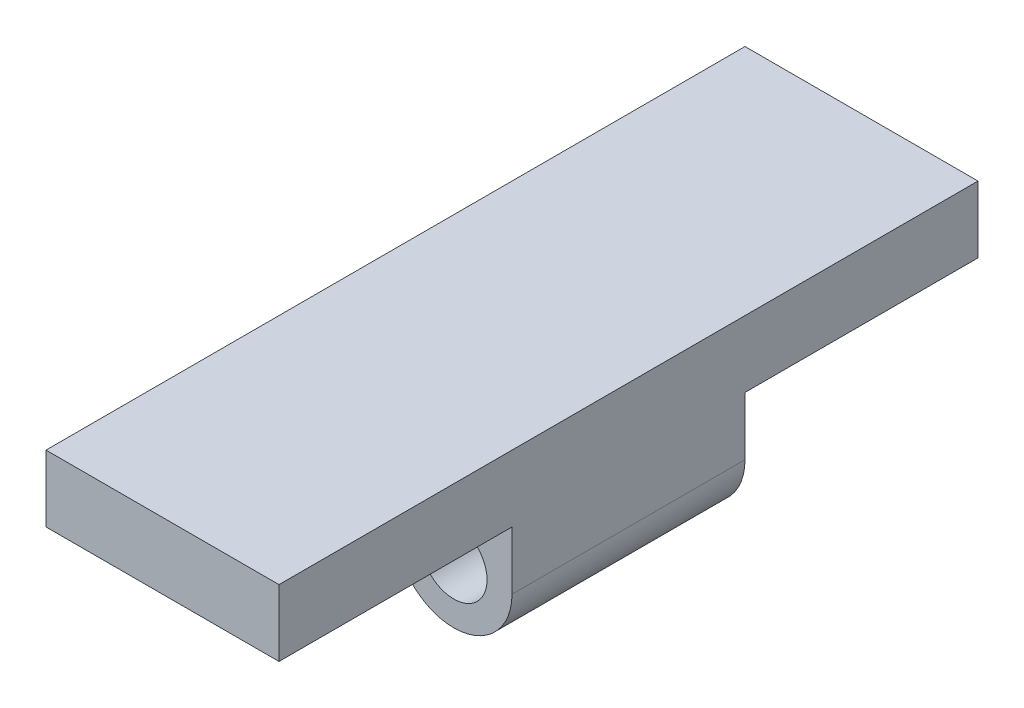
ISO-10303-21;
HEADER;
FILE_DESCRIPTION(('STEP AP214'),'2;1');
FILE_NAME('part.step','',(''),(''),'','','');
FILE_SCHEMA(('AUTOMOTIVE_DESIGN { 1 0 10303 214 1 1 1 1 }'));
ENDSEC;
DATA;
#1=APPLICATION_CONTEXT('core data for automotive mechanical design processes');
#2=APPLICATION_PROTOCOL_DEFINITION('international standard','automotive_design',2000,#1);
#3=PRODUCT_CONTEXT('',#1,'mechanical');
#4=PRODUCT('Part','Part','',(#3));
#5=PRODUCT_RELATED_PRODUCT_CATEGORY('part','',(#4));
#6=PRODUCT_DEFINITION_FORMATION('','',#4);
#7=PRODUCT_DEFINITION_CONTEXT('part definition',#1,'design');
#8=PRODUCT_DEFINITION('design','',#6,#7);
#9=PRODUCT_DEFINITION_SHAPE('','',#8);
#10=(LENGTH_UNIT() NAMED_UNIT(*) SI_UNIT(.MILLI.,.METRE.));
#11=(NAMED_UNIT(*) PLANE_ANGLE_UNIT() SI_UNIT($,.RADIAN.));
#12=(NAMED_UNIT(*) SI_UNIT($,.STERADIAN.) SOLID_ANGLE_UNIT());
#13=UNCERTAINTY_MEASURE_WITH_UNIT(LENGTH_MEASURE(1.E-05),#10,'distance_accuracy_value','');
#14=(GEOMETRIC_REPRESENTATION_CONTEXT(3) GLOBAL_UNCERTAINTY_ASSIGNED_CONTEXT((#13)) GLOBAL_UNIT_ASSIGNED_CONTEXT((#10,
#11,#12)) REPRESENTATION_CONTEXT('',''));
#15=CARTESIAN_POINT('',(0.,0.,0.));
#16=DIRECTION('',(0.,0.,1.));
#17=DIRECTION('',(1.,0.,0.));
#18=AXIS2_PLACEMENT_3D('',#15,#16,#17);
#19=CARTESIAN_POINT('',(-5.54065999602521,-1.7493965465254,4.5));
#20=DIRECTION('',(0.,0.,-1.));
#21=DIRECTION('',(-1.,0.,0.));
#22=AXIS2_PLACEMENT_3D('',#19,#20,#21);
#23=CYLINDRICAL_SURFACE('',#22,0.975);
#24=CARTESIAN_POINT('',(-5.54065999602521,-1.7493965465254,4.5));
#25=DIRECTION('',(0.,0.,1.));
#26=DIRECTION('',(1.,0.,0.));
#27=AXIS2_PLACEMENT_3D('',#24,#25,#26);
#28=CIRCLE('',#27,0.975);
#29=CARTESIAN_POINT('',(-4.56565999602521,-1.7493965465254,4.5));
#30=VERTEX_POINT('',#29);
#31=EDGE_CURVE('E11',#30,#30,#28,.T.);
#32=ORIENTED_EDGE('',*,*,#31,.F.);
#33=EDGE_LOOP('',(#32));
#34=FACE_BOUND('',#33,.T.);
#35=CARTESIAN_POINT('',(-5.54065999602521,-1.7493965465254,-4.5));
#36=DIRECTION('',(0.,0.,1.));
#37=DIRECTION('',(1.,0.,0.));
#38=AXIS2_PLACEMENT_3D('',#35,#36,#37);
#39=CIRCLE('',#38,0.975);
#40=CARTESIAN_POINT('',(-4.56565999602521,-1.7493965465254,-4.5));
#41=VERTEX_POINT('',#40);
#42=EDGE_CURVE('E58',#41,#41,#39,.T.);
#43=ORIENTED_EDGE('',*,*,#42,.T.);
#44=EDGE_LOOP('',(#43));
#45=FACE_BOUND('',#44,.T.);
#46=ADVANCED_FACE('F55',(#34,#45),#23,.T.);
#47=CARTESIAN_POINT('',(-5.54065999602521,-1.7493965465254,4.5));
#48=DIRECTION('',(0.,0.,1.));
#49=DIRECTION('',(1.,0.,0.));
#50=AXIS2_PLACEMENT_3D('',#47,#48,#49);
#51=PLANE('',#50);
#52=ORIENTED_EDGE('',*,*,#31,.T.);
#53=EDGE_LOOP('',(#52));
#54=FACE_BOUND('',#53,.T.);
#55=ADVANCED_FACE('F70',(#54),#51,.T.);
#56=CARTESIAN_POINT('',(-5.54065999602521,-1.7493965465254,-4.5));
#57=DIRECTION('',(0.,0.,1.));
#58=DIRECTION('',(1.,0.,0.));
#59=AXIS2_PLACEMENT_3D('',#56,#57,#58);
#60=PLANE('',#59);
#61=ORIENTED_EDGE('',*,*,#42,.F.);
#62=EDGE_LOOP('',(#61));
#63=FACE_BOUND('',#62,.T.);
#64=ADVANCED_FACE('F68',(#63),#60,.F.);
#65=CLOSED_SHELL('',(#46,#55,#64));
#66=MANIFOLD_SOLID_BREP('B2_NOT_SHOWN',#65);
#67=CARTESIAN_POINT('',(-3.59065999602521,2.0006034534746,10.5));
#68=DIRECTION('',(1.,0.,0.));
#69=DIRECTION('',(0.,1.,0.));
#70=AXIS2_PLACEMENT_3D('',#67,#68,#69);
#71=PLANE('',#70);
#72=DIRECTION('',(0.,-1.,0.));
#73=VECTOR('',#72,1.);
#74=CARTESIAN_POINT('',(-3.59065999602521,2.0006034534746,-10.5));
#75=LINE('',#74,#73);
#76=CARTESIAN_POINT('',(-3.59065999602521,2.0006034534746,-10.5));
#77=VERTEX_POINT('',#76);
#78=CARTESIAN_POINT('',(-3.59065999602521,0.000603453474596477,-10.5));
#79=VERTEX_POINT('',#78);
#80=EDGE_CURVE('E243',#77,#79,#75,.T.);
#81=ORIENTED_EDGE('',*,*,#80,.T.);
#82=DIRECTION('',(0.,0.,-1.));
#83=VECTOR('',#82,1.);
#84=CARTESIAN_POINT('',(-3.59065999602521,0.000603453474596477,10.5));
#85=LINE('',#84,#83);
#86=CARTESIAN_POINT('',(-3.59065999602521,0.000603453474596477,10.5));
#87=VERTEX_POINT('',#86);
#88=EDGE_CURVE('E277',#87,#79,#85,.T.);
#89=ORIENTED_EDGE('',*,*,#88,.F.);
#90=DIRECTION('',(0.,-1.,0.));
#91=VECTOR('',#90,1.);
#92=CARTESIAN_POINT('',(-3.59065999602521,2.0006034534746,10.5));
#93=LINE('',#92,#91);
#94=CARTESIAN_POINT('',(-3.59065999602521,2.0006034534746,10.5));
#95=VERTEX_POINT('',#94);
#96=EDGE_CURVE('E244',#95,#87,#93,.T.);
#97=ORIENTED_EDGE('',*,*,#96,.F.);
#98=DIRECTION('',(0.,0.,-1.));
#99=VECTOR('',#98,1.);
#100=CARTESIAN_POINT('',(-3.59065999602521,2.0006034534746,10.5));
#101=LINE('',#100,#99);
#102=EDGE_CURVE('E258',#95,#77,#101,.T.);
#103=ORIENTED_EDGE('',*,*,#102,.T.);
#104=EDGE_LOOP('',(#81,#89,#97,#103));
#105=FACE_BOUND('',#104,.T.);
#106=ADVANCED_FACE('F96',(#105),#71,.F.);
#107=CARTESIAN_POINT('',(-3.59065999602521,0.000603453474596477,10.5));
#108=DIRECTION('',(0.,1.,0.));
#109=DIRECTION('',(-1.,0.,0.));
#110=AXIS2_PLACEMENT_3D('',#107,#108,#109);
#111=PLANE('',#110);
#112=CARTESIAN_POINT('',(0.681720388759362,0.000603453474596471,-9.26955491219158));
#113=CARTESIAN_POINT('',(0.663542159192776,0.000603453474596471,-9.31656854773316));
#114=CARTESIAN_POINT('',(0.641406634725155,0.000603453474596471,-9.36213099101214));
#115=CARTESIAN_POINT('',(0.589751617970108,0.000603453474596471,-9.44896257911029));
#116=CARTESIAN_POINT('',(0.560214895027673,0.000603453474596471,-9.49022138270405));
#117=CARTESIAN_POINT('',(0.494626689584325,0.000603453474596471,-9.56714020949138));
#118=CARTESIAN_POINT('',(0.458580642596942,0.000603453474596471,-9.60280485791836));
#119=CARTESIAN_POINT('',(0.381035142719658,0.000603453474596471,-9.66755371808758));
#120=CARTESIAN_POINT('',(0.339538449105283,0.000603453474596471,-9.69664123922111));
#121=CARTESIAN_POINT('',(0.252252273186043,0.000603453474596471,-9.74754847292033));
#122=CARTESIAN_POINT('',(0.206458364747904,0.000603453474596471,-9.7693605841522));
#123=CARTESIAN_POINT('',(0.111934849875646,0.000603453474596471,-9.80522180176773));
#124=CARTESIAN_POINT('',(0.0632050621028175,0.000603453474596472,-9.81927042808255));
#125=CARTESIAN_POINT('',(-0.0373013947134258,0.000603453474596472,-9.83974704620741));
#126=CARTESIAN_POINT('',(-0.0891254702804252,0.000603453474596472,-9.84594109252989));
#127=CARTESIAN_POINT('',(-0.19310329433834,0.000603453474596472,-9.85011311445659));
#128=CARTESIAN_POINT('',(-0.245257180784777,0.000603453474596472,-9.84808738875449));
#129=CARTESIAN_POINT('',(-0.352172546323013,0.000603453474596472,-9.83588410514095));
#130=CARTESIAN_POINT('',(-0.406870867850129,0.000603453474596472,-9.82516279590368));
#131=CARTESIAN_POINT('',(-0.514030056087182,0.000603453474596472,-9.795788666266));
#132=CARTESIAN_POINT('',(-0.566491970102047,0.000603453474596472,-9.77713960432516));
#133=CARTESIAN_POINT('',(-0.656820825706323,0.000603453474596473,-9.73811264631092));
#134=CARTESIAN_POINT('',(-0.695290307925883,0.000603453474596473,-9.7190961077003));
#135=CARTESIAN_POINT('',(-0.770349262452686,0.000603453474596473,-9.67763343157583));
#136=CARTESIAN_POINT('',(-0.806937752158766,0.000603453474596473,-9.65518552541424));
#137=CARTESIAN_POINT('',(-0.878328341116614,0.000603453474596473,-9.60746502950204));
#138=CARTESIAN_POINT('',(-0.913125914327633,0.000603453474596473,-9.58218575111585));
#139=CARTESIAN_POINT('',(-0.981104258332806,0.000603453474596473,-9.52952478472204));
#140=CARTESIAN_POINT('',(-1.01428420415691,0.000603453474596473,-9.502142041934));
#141=CARTESIAN_POINT('',(-1.11752817456632,0.000603453474596473,-9.41315902780537));
#142=CARTESIAN_POINT('',(-1.18533222893316,0.000603453474596473,-9.34900431961328));
#143=CARTESIAN_POINT('',(-1.28789196642034,0.000603453474596474,-9.2535506716074));
#144=CARTESIAN_POINT('',(-1.3222722877457,0.000603453474596474,-9.22181618404493));
#145=CARTESIAN_POINT('',(-1.39200533909982,0.000603453474596474,-9.1595233867459));
#146=CARTESIAN_POINT('',(-1.42735646854325,0.000603453474596474,-9.12896331944109));
#147=CARTESIAN_POINT('',(-1.49979444003922,0.000603453474596474,-9.06898833931851));
#148=CARTESIAN_POINT('',(-1.53689787534192,0.000603453474596474,-9.03959348606564));
#149=CARTESIAN_POINT('',(-1.6120847474395,0.000603453474596474,-8.98207430890645));
#150=CARTESIAN_POINT('',(-1.65016850874754,0.000603453474596474,-8.95395041443503));
#151=CARTESIAN_POINT('',(-1.72676130761758,0.000603453474596474,-8.89796911260626));
#152=CARTESIAN_POINT('',(-1.76527144072327,0.000603453474596474,-8.87011323676237));
#153=CARTESIAN_POINT('',(-1.84174673025448,0.000603453474596475,-8.8136615004782));
#154=CARTESIAN_POINT('',(-1.87971197896252,0.000603453474596475,-8.78506576769646));
#155=CARTESIAN_POINT('',(-1.95365483678642,0.000603453474596475,-8.72660708858899));
#156=CARTESIAN_POINT('',(-1.98965502143664,0.000603453474596475,-8.69677318764794));
#157=CARTESIAN_POINT('',(-2.0595144338115,0.000603453474596475,-8.63470407397276));
#158=CARTESIAN_POINT('',(-2.09337495417057,0.000603453474596475,-8.60247033719395));
#159=CARTESIAN_POINT('',(-2.15797824031286,0.000603453474596475,-8.53534430066004));
#160=CARTESIAN_POINT('',(-2.18873771818079,0.000603453474596475,-8.50046824743378));
#161=CARTESIAN_POINT('',(-2.24652589572852,0.000603453474596475,-8.42777265241198));
#162=CARTESIAN_POINT('',(-2.27355839004416,0.000603453474596475,-8.38995616672181));
#163=CARTESIAN_POINT('',(-2.3139800477159,0.000603453474596475,-8.32597009114296));
#164=CARTESIAN_POINT('',(-2.32872305357184,0.000603453474596475,-8.3006513474368));
#165=CARTESIAN_POINT('',(-2.35624753829769,0.000603453474596475,-8.24894944486435));
#166=CARTESIAN_POINT('',(-2.36902761640685,0.000603453474596475,-8.22256554269204));
#167=CARTESIAN_POINT('',(-2.40427036375027,0.000603453474596475,-8.14168060912752));
#168=CARTESIAN_POINT('',(-2.42347215026709,0.000603453474596475,-8.08570071194039));
#169=CARTESIAN_POINT('',(-2.45195958171875,0.000603453474596475,-7.97107710771409));
#170=CARTESIAN_POINT('',(-2.46121439833696,0.000603453474596475,-7.91242570305744));
#171=CARTESIAN_POINT('',(-2.46885823413609,0.000603453474596475,-7.79449685830923));
#172=CARTESIAN_POINT('',(-2.4672691632409,0.000603453474596475,-7.73522092203291));
#173=CARTESIAN_POINT('',(-2.4534546682422,0.000603453474596475,-7.62231304790584));
#174=CARTESIAN_POINT('',(-2.44201354308564,0.000603453474596475,-7.568584807272));
#175=CARTESIAN_POINT('',(-2.40968446028118,0.000603453474596475,-7.4640256778887));
#176=CARTESIAN_POINT('',(-2.38879602044468,0.000603453474596475,-7.41319493717603));
#177=CARTESIAN_POINT('',(-2.33967109146057,0.000603453474596475,-7.31910060649296));
#178=CARTESIAN_POINT('',(-2.31195286541316,0.000603453474596475,-7.27556565589951));
#179=CARTESIAN_POINT('',(-2.24946301118781,0.000603453474596475,-7.19390053666834));
#180=CARTESIAN_POINT('',(-2.21469296363216,0.000603453474596475,-7.15576916010067));
#181=CARTESIAN_POINT('',(-2.13989115737953,0.000603453474596475,-7.08671410152857));
#182=CARTESIAN_POINT('',(-2.09997684813183,0.000603453474596475,-7.05566296853579));
#183=CARTESIAN_POINT('',(-2.01555117574501,0.000603453474596475,-7.00063802606994));
#184=CARTESIAN_POINT('',(-1.9710405340138,0.000603453474596475,-6.97666310823621));
#185=CARTESIAN_POINT('',(-1.8782496408283,0.000603453474596475,-6.93612396941247));
#186=CARTESIAN_POINT('',(-1.82993664463121,0.000603453474596475,-6.91963488635712));
#187=CARTESIAN_POINT('',(-1.73127226721783,0.000603453474596474,-6.89465524882504));
#188=CARTESIAN_POINT('',(-1.68091980789846,0.000603453474596474,-6.88616898391144));
#189=CARTESIAN_POINT('',(-1.57743237273474,0.000603453474596474,-6.87695744397063));
#190=CARTESIAN_POINT('',(-1.52426824664383,0.000603453474596474,-6.87656644518718));
#191=CARTESIAN_POINT('',(-1.41855946662129,0.000603453474596474,-6.88399868133448));
#192=CARTESIAN_POINT('',(-1.36601445866364,0.000603453474596474,-6.89181696595662));
#193=CARTESIAN_POINT('',(-1.28626403395644,0.000603453474596474,-6.90965253743286));
#194=CARTESIAN_POINT('',(-1.25843645151365,0.000603453474596474,-6.91703861411827));
#195=CARTESIAN_POINT('',(-1.20339214317216,0.000603453474596474,-6.93388225896658));
#196=CARTESIAN_POINT('',(-1.1761758162043,0.000603453474596473,-6.94334113896162));
#197=CARTESIAN_POINT('',(-1.12247254870455,0.000603453474596473,-6.96417391339395));
#198=CARTESIAN_POINT('',(-1.09598603945325,0.000603453474596473,-6.97554891305778));
#199=CARTESIAN_POINT('',(-1.04387898934529,0.000603453474596473,-7.00001010534023));
#200=CARTESIAN_POINT('',(-1.01825697640921,0.000603453474596473,-7.01309318288316));
#201=CARTESIAN_POINT('',(-0.944344463379301,0.000603453474596473,-7.0537448393978));
#202=CARTESIAN_POINT('',(-0.897213972725778,0.000603453474596473,-7.08343733594015));
#203=CARTESIAN_POINT('',(-0.805999352446716,0.000603453474596473,-7.14719698219771));
#204=CARTESIAN_POINT('',(-0.761919303381317,0.000603453474596473,-7.18126982387998));
#205=CARTESIAN_POINT('',(-0.675827108923218,0.000603453474596473,-7.25250484474097));
#206=CARTESIAN_POINT('',(-0.63383271976555,0.000603453474596473,-7.28968805711166));
#207=CARTESIAN_POINT('',(-0.551003365190106,0.000603453474596472,-7.36528682246381));
#208=CARTESIAN_POINT('',(-0.510168368521605,0.000603453474596472,-7.40370234216959));
#209=CARTESIAN_POINT('',(-0.427516445444948,0.000603453474596472,-7.4806235962903));
#210=CARTESIAN_POINT('',(-0.385693737324139,0.000603453474596472,-7.51912331196266));
#211=CARTESIAN_POINT('',(-0.300377716040168,0.000603453474596472,-7.5941968489123));
#212=CARTESIAN_POINT('',(-0.256885516936883,0.000603453474596472,-7.63077191716624));
#213=CARTESIAN_POINT('',(-0.168247595007555,0.000603453474596472,-7.70155725321176));
#214=CARTESIAN_POINT('',(-0.123107276337051,0.000603453474596472,-7.73577434460995));
#215=CARTESIAN_POINT('',(-0.0320044677015208,0.000603453474596472,-7.80312070557043));
#216=CARTESIAN_POINT('',(0.013958452786283,0.000603453474596472,-7.83624937814832));
#217=CARTESIAN_POINT('',(0.0904487343187735,0.000603453474596472,-7.89236441040536));
#218=CARTESIAN_POINT('',(0.121128199115598,0.000603453474596472,-7.91514021866265));
#219=CARTESIAN_POINT('',(0.181807662982751,0.000603453474596471,-7.96159943020429));
#220=CARTESIAN_POINT('',(0.211807559749918,0.000603453474596471,-7.9852829687139));
#221=CARTESIAN_POINT('',(0.270586273891709,0.000603453474596471,-8.03392857590256));
#222=CARTESIAN_POINT('',(0.299369020675024,0.000603453474596471,-8.05888584652753));
#223=CARTESIAN_POINT('',(0.355392575272122,0.000603453474596471,-8.11049462035996));
#224=CARTESIAN_POINT('',(0.382633220210745,0.000603453474596471,-8.13714630190051));
#225=CARTESIAN_POINT('',(0.435593985410183,0.000603453474596471,-8.19284460220643));
#226=CARTESIAN_POINT('',(0.461278490712908,0.000603453474596471,-8.22192535927447));
#227=CARTESIAN_POINT('',(0.510119398760506,0.000603453474596471,-8.28214861708743));
#228=CARTESIAN_POINT('',(0.533275866992297,0.000603453474596471,-8.31329106439223));
#229=CARTESIAN_POINT('',(0.576636575451473,0.000603453474596471,-8.37765751021521));
#230=CARTESIAN_POINT('',(0.596835833125466,0.000603453474596471,-8.41088489007489));
#231=CARTESIAN_POINT('',(0.63378996785883,0.000603453474596471,-8.47920211342516));
#232=CARTESIAN_POINT('',(0.650544914607798,0.000603453474596471,-8.51429191921475));
#233=CARTESIAN_POINT('',(0.686939201644475,0.000603453474596471,-8.60239129544451));
#234=CARTESIAN_POINT('',(0.704439891023661,0.000603453474596471,-8.65630985553794));
#235=CARTESIAN_POINT('',(0.730216650062091,0.000603453474596471,-8.76628129678649));
#236=CARTESIAN_POINT('',(0.738500317990543,0.000603453474596471,-8.82233238046));
#237=CARTESIAN_POINT('',(0.745186883892795,0.000603453474596471,-8.93533881516929));
#238=CARTESIAN_POINT('',(0.743536469753532,0.000603453474596471,-8.99229740619061));
#239=CARTESIAN_POINT('',(0.729909630583895,0.000603453474596471,-9.10488402657672));
#240=CARTESIAN_POINT('',(0.717960641390336,0.000603453474596471,-9.16051518794005));
#241=CARTESIAN_POINT('',(0.695167169097829,0.000603453474596471,-9.23303614006756));
#242=CARTESIAN_POINT('',(0.688738718310995,0.000603453474596471,-9.25140368429326));
#243=CARTESIAN_POINT('',(0.681720388759362,0.000603453474596471,-9.26955491219158));
#244=B_SPLINE_CURVE_WITH_KNOTS('',3,(#112,#113,#114,#115,#116,#117,#118,#119,#120,#121,#122,
#123,#124,#125,#126,#127,#128,#129,#130,#131,#132,#133,#134,#135,#136,#137,#138,#139,#140,#141,
#142,#143,#144,#145,#146,#147,#148,#149,#150,#151,#152,#153,#154,#155,#156,#157,#158,#159,#160,
#161,#162,#163,#164,#165,#166,#167,#168,#169,#170,#171,#172,#173,#174,#175,#176,#177,#178,#179,
#180,#181,#182,#183,#184,#185,#186,#187,#188,#189,#190,#191,#192,#193,#194,#195,#196,#197,#198,
#199,#200,#201,#202,#203,#204,#205,#206,#207,#208,#209,#210,#211,#212,#213,#214,#215,#216,#217,
#218,#219,#220,#221,#222,#223,#224,#225,#226,#227,#228,#229,#230,#231,#232,#233,#234,#235,#236,
#237,#238,#239,#240,#241,#242,#243),.UNSPECIFIED.,.T.,.F.,(4,2,2,2,2,2,2,2,2,2,2,2,2,2,2,2,2,2,
2,2,2,2,2,2,2,2,2,2,2,2,2,2,2,2,2,2,2,2,2,2,2,2,2,2,2,2,2,2,2,2,2,2,2,2,2,2,2,2,2,2,2,2,2,2,2,
4),(0.,0.151164118469508,0.30268348453763,0.454076906816299,0.605393982612288,0.756868662561883,
0.908352708168704,1.06425011848264,1.22021773610776,1.38676726527574,1.55323792306437,
1.68179020768643,1.81040897751515,1.93933826441038,2.06833263020201,2.34823240762702,
2.48859797591869,2.62874457915119,2.77071365934773,2.91273035516449,3.05531961237658,
3.19788442848979,3.33807432660754,3.47817870578663,3.61748238621272,3.75664317003561,
3.84445858651682,3.93233638049905,4.10898894778763,4.28618744365989,4.46302801859321,
4.62696936849787,4.79091908687276,4.94499554176079,5.09903749945367,5.25003786764291,
5.40101457179884,5.55347488113274,5.70601686382416,5.86484571340674,6.02357884202437,
6.10988267612091,6.1962412885974,6.28264988475744,6.36890304045819,6.53565106354301,
6.70261799714759,6.87082293597186,7.03902333662083,7.2095358417172,7.37993647626622,
7.54982126969135,7.71979773790868,7.83441886134313,7.94905712685103,8.06329153417266,
8.17753798438649,8.29381428997588,8.41008758279904,8.52655458191774,8.64301922429875,
8.81230874762483,8.98145860949942,9.15151703523014,9.32112381360233,9.37948591074248),.UNSPECIFIED.);
#245=CARTESIAN_POINT('',(-0.103953527009469,0.000603453474596503,-7.74983988624795));
#246=VERTEX_POINT('',#245);
#247=CARTESIAN_POINT('',(-1.32074879400657,0.000603453474596474,-9.22351415405548));
#248=VERTEX_POINT('',#247);
#249=EDGE_CURVE('E104',#246,#248,#244,.T.);
#250=ORIENTED_EDGE('',*,*,#249,.T.);
#251=CARTESIAN_POINT('',(-0.0906599960252118,0.000603453474596477,-9.));
#252=DIRECTION('',(0.,1.,0.));
#253=DIRECTION('',(0.771112757085456,0.,-0.636698606767808));
#254=AXIS2_PLACEMENT_3D('',#251,#252,#253);
#255=ELLIPSE('',#254,4.05663515435024,0.975);
#256=EDGE_CURVE('E53',#248,#246,#255,.T.);
#257=ORIENTED_EDGE('',*,*,#256,.T.);
#258=EDGE_LOOP('',(#250,#257));
#259=FACE_BOUND('',#258,.T.);
#260=CARTESIAN_POINT('',(0.681720388759362,0.000603453474596471,9.26955491219158));
#261=CARTESIAN_POINT('',(0.700764740771993,0.000603453474596471,9.22027159017833));
#262=CARTESIAN_POINT('',(0.715517018024322,0.000603453474596471,9.16924132518396));
#263=CARTESIAN_POINT('',(0.736082609181691,0.000603453474596471,9.06532769512733));
#264=CARTESIAN_POINT('',(0.741872372406642,0.000603453474596471,9.01243982007719));
#265=CARTESIAN_POINT('',(0.744544172819335,0.000603453474596471,8.9066248837931));
#266=CARTESIAN_POINT('',(0.741456419544943,0.000603453474596471,8.85369856673531));
#267=CARTESIAN_POINT('',(0.726855843784587,0.000603453474596471,8.74906262619991));
#268=CARTESIAN_POINT('',(0.715345548881525,0.000603453474596471,8.69735264250794));
#269=CARTESIAN_POINT('',(0.683864785720113,0.000603453474596471,8.5938351805739));
#270=CARTESIAN_POINT('',(0.663509366920101,0.000603453474596471,8.54214575527078));
#271=CARTESIAN_POINT('',(0.615409246401511,0.000603453474596471,8.44238815090647));
#272=CARTESIAN_POINT('',(0.587667216386136,0.000603453474596471,8.39431867057617));
#273=CARTESIAN_POINT('',(0.533355512861089,0.000603453474596471,8.31320535622514));
#274=CARTESIAN_POINT('',(0.508056476634309,0.000603453474596471,8.27929415829332));
#275=CARTESIAN_POINT('',(0.454473527179857,0.000603453474596471,8.21390154392221));
#276=CARTESIAN_POINT('',(0.426188153441746,0.000603453474596471,8.18242132954218));
#277=CARTESIAN_POINT('',(0.36716296460378,0.000603453474596471,8.12168931165568));
#278=CARTESIAN_POINT('',(0.336415831661341,0.000603453474596471,8.09244469843758));
#279=CARTESIAN_POINT('',(0.273136775384812,0.000603453474596471,8.03594058912646));
#280=CARTESIAN_POINT('',(0.240603989892734,0.000603453474596471,8.00868206701669));
#281=CARTESIAN_POINT('',(0.135995284928362,0.000603453474596471,7.92496525294896));
#282=CARTESIAN_POINT('',(0.0617704719501922,0.000603453474596472,7.87126220872732));
#283=CARTESIAN_POINT('',(-0.0491512380930364,0.000603453474596472,7.79040028737675));
#284=CARTESIAN_POINT('',(-0.0860173422831041,0.000603453474596472,7.76342361495343));
#285=CARTESIAN_POINT('',(-0.158944118220009,0.000603453474596472,7.70845876009712));
#286=CARTESIAN_POINT('',(-0.19500561635107,0.000603453474596472,7.68047170084986));
#287=CARTESIAN_POINT('',(-0.259209187336742,0.000603453474596472,7.62851583802128));
#288=CARTESIAN_POINT('',(-0.287552619065813,0.000603453474596472,7.6047956273487));
#289=CARTESIAN_POINT('',(-0.343498944313911,0.000603453474596472,7.55649496785575));
#290=CARTESIAN_POINT('',(-0.371101782159311,0.000603453474596472,7.53191445468104));
#291=CARTESIAN_POINT('',(-0.453245964540051,0.000603453474596472,7.45721494368362));
#292=CARTESIAN_POINT('',(-0.506997161757012,0.000603453474596472,7.40624314719901));
#293=CARTESIAN_POINT('',(-0.615686752556619,0.000603453474596473,7.30584149428025));
#294=CARTESIAN_POINT('',(-0.670621525942715,0.000603453474596473,7.25640782656513));
#295=CARTESIAN_POINT('',(-0.784756404700996,0.000603453474596473,7.16284326675556));
#296=CARTESIAN_POINT('',(-0.843942380999834,0.000603453474596473,7.11869600113977));
#297=CARTESIAN_POINT('',(-0.932209828070283,0.000603453474596473,7.06200407300028));
#298=CARTESIAN_POINT('',(-0.959004846964745,0.000603453474596473,7.04589833967586));
#299=CARTESIAN_POINT('',(-1.01361128531666,0.000603453474596473,7.01547889876705));
#300=CARTESIAN_POINT('',(-1.04142328128085,0.000603453474596473,7.00116622864106));
#301=CARTESIAN_POINT('',(-1.12637271570941,0.000603453474596473,6.96127758559933));
#302=CARTESIAN_POINT('',(-1.18500686143975,0.000603453474596473,6.93876202947927));
#303=CARTESIAN_POINT('',(-1.30567753889479,0.000603453474596474,6.90353591194142));
#304=CARTESIAN_POINT('',(-1.36773655531696,0.000603453474596474,6.89090122262026));
#305=CARTESIAN_POINT('',(-1.4931477635963,0.000603453474596474,6.87706643957303));
#306=CARTESIAN_POINT('',(-1.55649930140632,0.000603453474596474,6.87586069961719));
#307=CARTESIAN_POINT('',(-1.67836428902438,0.000603453474596474,6.88534029877459));
#308=CARTESIAN_POINT('',(-1.73693394864087,0.000603453474596474,6.89529213877205));
#309=CARTESIAN_POINT('',(-1.8511724009165,0.000603453474596475,6.92601870080324));
#310=CARTESIAN_POINT('',(-1.90684249726978,0.000603453474596475,6.94678851186564));
#311=CARTESIAN_POINT('',(-2.00774376447779,0.000603453474596475,6.99602777824321));
#312=CARTESIAN_POINT('',(-2.05346119578465,0.000603453474596475,7.02350507497817));
#313=CARTESIAN_POINT('',(-2.13934369794721,0.000603453474596475,7.08606988128806));
#314=CARTESIAN_POINT('',(-2.17951105580848,0.000603453474596475,7.1211542408348));
#315=CARTESIAN_POINT('',(-2.25139738233025,0.000603453474596475,7.19620719155594));
#316=CARTESIAN_POINT('',(-2.28340742842565,0.000603453474596475,7.23589760374575));
#317=CARTESIAN_POINT('',(-2.34024637614064,0.000603453474596475,7.32012906364484));
#318=CARTESIAN_POINT('',(-2.36507487692412,0.000603453474596475,7.36467038191527));
#319=CARTESIAN_POINT('',(-2.40673049506519,0.000603453474596475,7.45693878895537));
#320=CARTESIAN_POINT('',(-2.42361628320716,0.000603453474596475,7.5046394501935));
#321=CARTESIAN_POINT('',(-2.44930654938647,0.000603453474596475,7.60213589018907));
#322=CARTESIAN_POINT('',(-2.45811487604193,0.000603453474596475,7.6519306593392));
#323=CARTESIAN_POINT('',(-2.4677124207544,0.000603453474596475,7.7533232180115));
#324=CARTESIAN_POINT('',(-2.46833118203492,0.000603453474596475,7.80493697198275));
#325=CARTESIAN_POINT('',(-2.46136362180587,0.000603453474596475,7.90767624794706));
#326=CARTESIAN_POINT('',(-2.45376335110844,0.000603453474596475,7.95880079088238));
#327=CARTESIAN_POINT('',(-2.43022421497923,0.000603453474596475,8.06216111846974));
#328=CARTESIAN_POINT('',(-2.41383297636982,0.000603453474596475,8.11429302195704));
#329=CARTESIAN_POINT('',(-2.37345912398979,0.000603453474596475,8.21527649306432));
#330=CARTESIAN_POINT('',(-2.34950484298452,0.000603453474596475,8.26413949185236));
#331=CARTESIAN_POINT('',(-2.3030850243246,0.000603453474596475,8.34432954704463));
#332=CARTESIAN_POINT('',(-2.28222946637484,0.000603453474596475,8.37660885871844));
#333=CARTESIAN_POINT('',(-2.2377081284498,0.000603453474596475,8.43916949701123));
#334=CARTESIAN_POINT('',(-2.21404202175172,0.000603453474596475,8.46945059070207));
#335=CARTESIAN_POINT('',(-2.16414183539299,0.000603453474596475,8.52825011450392));
#336=CARTESIAN_POINT('',(-2.13788745676503,0.000603453474596475,8.55675118335856));
#337=CARTESIAN_POINT('',(-2.08346207437792,0.000603453474596475,8.61182378481056));
#338=CARTESIAN_POINT('',(-2.05529179071286,0.000603453474596475,8.63839603467753));
#339=CARTESIAN_POINT('',(-1.98062020008459,0.000603453474596475,8.70489034785367));
#340=CARTESIAN_POINT('',(-1.93301144780866,0.000603453474596475,8.74355794110878));
#341=CARTESIAN_POINT('',(-1.83585569259717,0.000603453474596474,8.8184363270663));
#342=CARTESIAN_POINT('',(-1.78630580696458,0.000603453474596474,8.85464322920414));
#343=CARTESIAN_POINT('',(-1.68705014300027,0.000603453474596474,8.92697963143418));
#344=CARTESIAN_POINT('',(-1.63734424770864,0.000603453474596474,8.96310898067557));
#345=CARTESIAN_POINT('',(-1.56395422074636,0.000603453474596474,9.01878289427688));
#346=CARTESIAN_POINT('',(-1.53970411647811,0.000603453474596474,9.03757230350974));
#347=CARTESIAN_POINT('',(-1.49170046082308,0.000603453474596474,9.07577389618198));
#348=CARTESIAN_POINT('',(-1.467946890438,0.000603453474596474,9.09518605572149));
#349=CARTESIAN_POINT('',(-1.42105461435965,0.000603453474596474,9.13458023149381));
#350=CARTESIAN_POINT('',(-1.39791410002817,0.000603453474596474,9.15456009711274));
#351=CARTESIAN_POINT('',(-1.35209012370407,0.000603453474596474,9.1950384898229));
#352=CARTESIAN_POINT('',(-1.32940669226868,0.000603453474596474,9.21553705138506));
#353=CARTESIAN_POINT('',(-1.26173102073436,0.000603453474596474,9.27758243189601));
#354=CARTESIAN_POINT('',(-1.21718880289556,0.000603453474596474,9.31961370489647));
#355=CARTESIAN_POINT('',(-1.12743524377217,0.000603453474596473,9.40279308314284));
#356=CARTESIAN_POINT('',(-1.08222539117697,0.000603453474596473,9.44394276311492));
#357=CARTESIAN_POINT('',(-0.989287253602501,0.000603453474596473,9.52323137004928));
#358=CARTESIAN_POINT('',(-0.941563517120565,0.000603453474596473,9.56137544279163));
#359=CARTESIAN_POINT('',(-0.863945335728422,0.000603453474596473,9.61724870574198));
#360=CARTESIAN_POINT('',(-0.835275055175621,0.000603453474596473,9.63666778642013));
#361=CARTESIAN_POINT('',(-0.776688229962669,0.000603453474596473,9.67356985589599));
#362=CARTESIAN_POINT('',(-0.746770783718767,0.000603453474596473,9.69105140943283));
#363=CARTESIAN_POINT('',(-0.655484925336478,0.000603453474596473,9.73986860031823));
#364=CARTESIAN_POINT('',(-0.592235838620774,0.000603453474596473,9.76783567804099));
#365=CARTESIAN_POINT('',(-0.460937434121085,0.000603453474596472,9.81251971364459));
#366=CARTESIAN_POINT('',(-0.392838677435043,0.000603453474596472,9.82909419261946));
#367=CARTESIAN_POINT('',(-0.254378923990019,0.000603453474596472,9.84850199650391));
#368=CARTESIAN_POINT('',(-0.184011278897801,0.000603453474596472,9.85129037075809));
#369=CARTESIAN_POINT('',(-0.0542217802740896,0.000603453474596472,9.84253269361031));
#370=CARTESIAN_POINT('',(0.00533549840832721,0.000603453474596472,9.83296588198248));
#371=CARTESIAN_POINT('',(0.121447252355157,0.000603453474596471,9.80269660763183));
#372=CARTESIAN_POINT('',(0.178008500347586,0.000603453474596471,9.78202055155389));
#373=CARTESIAN_POINT('',(0.279935964292223,0.000603453474596471,9.73295998609693));
#374=CARTESIAN_POINT('',(0.32584633618882,0.000603453474596471,9.70569971123462));
#375=CARTESIAN_POINT('',(0.412193118793338,0.000603453474596471,9.64349044817518));
#376=CARTESIAN_POINT('',(0.452626018869623,0.000603453474596471,9.60853656628814));
#377=CARTESIAN_POINT('',(0.525017823699625,0.000603453474596471,9.53370486298095));
#378=CARTESIAN_POINT('',(0.557270366989841,0.000603453474596471,9.49410984093595));
#379=CARTESIAN_POINT('',(0.614528369494794,0.000603453474596471,9.41009307923902));
#380=CARTESIAN_POINT('',(0.639552451251806,0.000603453474596471,9.3656841554007));
#381=CARTESIAN_POINT('',(0.668172288657241,0.000603453474596471,9.30310723728407));
#382=CARTESIAN_POINT('',(0.675198054781529,0.000603453474596471,9.28643352720008));
#383=CARTESIAN_POINT('',(0.681720388759362,0.000603453474596471,9.26955491219158));
#384=B_SPLINE_CURVE_WITH_KNOTS('',3,(#260,#261,#262,#263,#264,#265,#266,#267,#268,#269,#270,
#271,#272,#273,#274,#275,#276,#277,#278,#279,#280,#281,#282,#283,#284,#285,#286,#287,#288,#289,
#290,#291,#292,#293,#294,#295,#296,#297,#298,#299,#300,#301,#302,#303,#304,#305,#306,#307,#308,
#309,#310,#311,#312,#313,#314,#315,#316,#317,#318,#319,#320,#321,#322,#323,#324,#325,#326,#327,
#328,#329,#330,#331,#332,#333,#334,#335,#336,#337,#338,#339,#340,#341,#342,#343,#344,#345,#346,
#347,#348,#349,#350,#351,#352,#353,#354,#355,#356,#357,#358,#359,#360,#361,#362,#363,#364,#365,
#366,#367,#368,#369,#370,#371,#372,#373,#374,#375,#376,#377,#378,#379,#380,#381,#382,#383),
.UNSPECIFIED.,.T.,.F.,(4,2,2,2,2,2,2,2,2,2,2,2,2,2,2,2,2,2,2,2,2,2,2,2,2,2,2,2,2,2,2,2,2,2,2,2,
2,2,2,2,2,2,2,2,2,2,2,2,2,2,2,2,2,2,2,2,2,2,2,2,2,4),(0.,0.158453026934827,0.31732171625708,
0.475650427611653,0.633931644406598,0.799926310152834,0.965861017761852,1.09260461978551,
1.2194104972326,1.34660841012271,1.47386828704907,1.748554654263,1.88560990903362,
2.02251723517977,2.133376441746,2.24424395885735,2.46647033410969,2.6880932526329,
2.90901093986881,3.00273714805286,3.09651733777403,3.28413736904773,3.47318430430914,
3.66213784007569,3.83936198103467,4.0165057386139,4.17571894953649,4.33486635693755,
4.48710436189702,4.63935086234246,4.79045437625534,4.94148585734753,5.0956560642326,
5.25008833715583,5.41335976905544,5.57602666732163,5.69116549830992,5.80631772717048,
5.92245838684884,6.03855563367696,6.2223757160259,6.40647997928917,6.59081165060401,
6.68283423874786,6.77485329946941,6.86656097801212,6.95827476725314,7.14200128985105,
7.32536638195585,7.50841039433273,7.61222305909874,7.71611211825548,7.92260278516454,
8.13163106100106,8.34134044219226,8.52127146120567,8.70077666462248,8.86015507262869,
9.01963515129341,9.17212852680534,9.32422545937209,9.37849265422241),.UNSPECIFIED.);
#385=CARTESIAN_POINT('',(-1.32074879400663,0.000603453474596505,9.22351415405562));
#386=VERTEX_POINT('',#385);
#387=CARTESIAN_POINT('',(-0.1039535270095,0.000603453474596472,7.74983988624797));
#388=VERTEX_POINT('',#387);
#389=EDGE_CURVE('E188',#386,#388,#384,.T.);
#390=ORIENTED_EDGE('',*,*,#389,.T.);
#391=CARTESIAN_POINT('',(-0.0906599960252118,0.000603453474596477,9.));
#392=DIRECTION('',(0.,1.,0.));
#393=DIRECTION('',(0.771112757085456,0.,0.636698606767808));
#394=AXIS2_PLACEMENT_3D('',#391,#392,#393);
#395=ELLIPSE('',#394,4.05663515435024,0.975);
#396=EDGE_CURVE('E174',#388,#386,#395,.T.);
#397=ORIENTED_EDGE('',*,*,#396,.T.);
#398=EDGE_LOOP('',(#390,#397));
#399=FACE_BOUND('',#398,.T.);
#400=DIRECTION('',(0.,0.,-1.));
#401=VECTOR('',#400,1.);
#402=CARTESIAN_POINT('',(3.40934000397479,0.000603453474596467,10.5));
#403=LINE('',#402,#401);
#404=CARTESIAN_POINT('',(3.40934000397479,0.000603453474596467,-3.5));
#405=VERTEX_POINT('',#404);
#406=CARTESIAN_POINT('',(3.40934000397479,0.000603453474596467,-10.5));
#407=VERTEX_POINT('',#406);
#408=EDGE_CURVE('E190',#405,#407,#403,.T.);
#409=ORIENTED_EDGE('',*,*,#408,.F.);
#410=DIRECTION('',(-1.,0.,0.));
#411=VECTOR('',#410,1.);
#412=CARTESIAN_POINT('',(-0.0906599960252135,0.000603453474596474,-3.5));
#413=LINE('',#412,#411);
#414=CARTESIAN_POINT('',(-0.0906599960252135,0.000603453474596474,-3.5));
#415=VERTEX_POINT('',#414);
#416=EDGE_CURVE('E193',#405,#415,#413,.T.);
#417=ORIENTED_EDGE('',*,*,#416,.T.);
#418=DIRECTION('',(0.,0.,-1.));
#419=VECTOR('',#418,1.);
#420=CARTESIAN_POINT('',(-0.0906599960252135,0.000603453474596474,3.5));
#421=LINE('',#420,#419);
#422=CARTESIAN_POINT('',(-0.0906599960252135,0.000603453474596474,3.5));
#423=VERTEX_POINT('',#422);
#424=EDGE_CURVE('E240',#423,#415,#421,.T.);
#425=ORIENTED_EDGE('',*,*,#424,.F.);
#426=DIRECTION('',(-1.,0.,0.));
#427=VECTOR('',#426,1.);
#428=CARTESIAN_POINT('',(-0.0906599960252135,0.000603453474596474,3.5));
#429=LINE('',#428,#427);
#430=CARTESIAN_POINT('',(3.40934000397479,0.000603453474596467,3.5));
#431=VERTEX_POINT('',#430);
#432=EDGE_CURVE('E212',#431,#423,#429,.T.);
#433=ORIENTED_EDGE('',*,*,#432,.F.);
#434=CARTESIAN_POINT('',(3.40934000397479,0.000603453474596467,10.5));
#435=VERTEX_POINT('',#434);
#436=EDGE_CURVE('E200',#435,#431,#403,.T.);
#437=ORIENTED_EDGE('',*,*,#436,.F.);
#438=DIRECTION('',(1.,0.,0.));
#439=VECTOR('',#438,1.);
#440=CARTESIAN_POINT('',(-3.59065999602521,0.000603453474596477,10.5));
#441=LINE('',#440,#439);
#442=EDGE_CURVE('E248',#87,#435,#441,.T.);
#443=ORIENTED_EDGE('',*,*,#442,.F.);
#444=ORIENTED_EDGE('',*,*,#88,.T.);
#445=DIRECTION('',(1.,0.,0.));
#446=VECTOR('',#445,1.);
#447=CARTESIAN_POINT('',(-3.59065999602521,0.000603453474596477,-10.5));
#448=LINE('',#447,#446);
#449=EDGE_CURVE('E196',#79,#407,#448,.T.);
#450=ORIENTED_EDGE('',*,*,#449,.T.);
#451=EDGE_LOOP('',(#409,#417,#425,#433,#437,#443,#444,#450));
#452=FACE_BOUND('',#451,.T.);
#453=ADVANCED_FACE('F181',(#259,#399,#452),#111,.F.);
#454=CARTESIAN_POINT('',(3.40934000397479,2.0006034534746,10.5));
#455=DIRECTION('',(-1.,0.,0.));
#456=DIRECTION('',(0.,-1.,0.));
#457=AXIS2_PLACEMENT_3D('',#454,#455,#456);
#458=PLANE('',#457);
#459=DIRECTION('',(0.,1.,0.));
#460=VECTOR('',#459,1.);
#461=CARTESIAN_POINT('',(3.40934000397479,2.0006034534746,-10.5));
#462=LINE('',#461,#460);
#463=CARTESIAN_POINT('',(3.40934000397479,2.0006034534746,-10.5));
#464=VERTEX_POINT('',#463);
#465=EDGE_CURVE('E264',#407,#464,#462,.T.);
#466=ORIENTED_EDGE('',*,*,#465,.T.);
#467=DIRECTION('',(0.,0.,-1.));
#468=VECTOR('',#467,1.);
#469=CARTESIAN_POINT('',(3.40934000397479,2.0006034534746,10.5));
#470=LINE('',#469,#468);
#471=CARTESIAN_POINT('',(3.40934000397479,2.0006034534746,10.5));
#472=VERTEX_POINT('',#471);
#473=EDGE_CURVE('E201',#472,#464,#470,.T.);
#474=ORIENTED_EDGE('',*,*,#473,.F.);
#475=DIRECTION('',(0.,1.,0.));
#476=VECTOR('',#475,1.);
#477=CARTESIAN_POINT('',(3.40934000397479,2.0006034534746,10.5));
#478=LINE('',#477,#476);
#479=EDGE_CURVE('E252',#435,#472,#478,.T.);
#480=ORIENTED_EDGE('',*,*,#479,.F.);
#481=ORIENTED_EDGE('',*,*,#436,.T.);
#482=DIRECTION('',(0.,1.,0.));
#483=VECTOR('',#482,1.);
#484=CARTESIAN_POINT('',(3.40934000397479,0.000603453474596467,3.5));
#485=LINE('',#484,#483);
#486=CARTESIAN_POINT('',(3.40934000397479,-1.7493965465254,3.5));
#487=VERTEX_POINT('',#486);
#488=EDGE_CURVE('E229',#487,#431,#485,.T.);
#489=ORIENTED_EDGE('',*,*,#488,.F.);
#490=DIRECTION('',(0.,0.,-1.));
#491=VECTOR('',#490,1.);
#492=CARTESIAN_POINT('',(3.40934000397479,-1.7493965465254,3.5));
#493=LINE('',#492,#491);
#494=CARTESIAN_POINT('',(3.40934000397479,-1.7493965465254,-3.5));
#495=VERTEX_POINT('',#494);
#496=EDGE_CURVE('E208',#487,#495,#493,.T.);
#497=ORIENTED_EDGE('',*,*,#496,.T.);
#498=DIRECTION('',(0.,1.,0.));
#499=VECTOR('',#498,1.);
#500=CARTESIAN_POINT('',(3.40934000397479,0.000603453474596467,-3.5));
#501=LINE('',#500,#499);
#502=EDGE_CURVE('E205',#495,#405,#501,.T.);
#503=ORIENTED_EDGE('',*,*,#502,.T.);
#504=ORIENTED_EDGE('',*,*,#408,.T.);
#505=EDGE_LOOP('',(#466,#474,#480,#481,#489,#497,#503,#504));
#506=FACE_BOUND('',#505,.T.);
#507=ADVANCED_FACE('F184',(#506),#458,.F.);
#508=CARTESIAN_POINT('',(-3.59065999602521,2.0006034534746,10.5));
#509=DIRECTION('',(0.,-1.,0.));
#510=DIRECTION('',(0.,0.,-1.));
#511=AXIS2_PLACEMENT_3D('',#508,#509,#510);
#512=PLANE('',#511);
#513=DIRECTION('',(-1.,0.,0.));
#514=VECTOR('',#513,1.);
#515=CARTESIAN_POINT('',(-3.59065999602521,2.0006034534746,-10.5));
#516=LINE('',#515,#514);
#517=EDGE_CURVE('E249',#464,#77,#516,.T.);
#518=ORIENTED_EDGE('',*,*,#517,.T.);
#519=ORIENTED_EDGE('',*,*,#102,.F.);
#520=DIRECTION('',(-1.,0.,0.));
#521=VECTOR('',#520,1.);
#522=CARTESIAN_POINT('',(-3.59065999602521,2.0006034534746,10.5));
#523=LINE('',#522,#521);
#524=EDGE_CURVE('E255',#472,#95,#523,.T.);
#525=ORIENTED_EDGE('',*,*,#524,.F.);
#526=ORIENTED_EDGE('',*,*,#473,.T.);
#527=EDGE_LOOP('',(#518,#519,#525,#526));
#528=FACE_BOUND('',#527,.T.);
#529=ADVANCED_FACE('F319',(#528),#512,.F.);
#530=CARTESIAN_POINT('',(0.,0.,10.5));
#531=DIRECTION('',(0.,0.,1.));
#532=DIRECTION('',(1.,0.,0.));
#533=AXIS2_PLACEMENT_3D('',#530,#531,#532);
#534=PLANE('',#533);
#535=ORIENTED_EDGE('',*,*,#96,.T.);
#536=ORIENTED_EDGE('',*,*,#442,.T.);
#537=ORIENTED_EDGE('',*,*,#479,.T.);
#538=ORIENTED_EDGE('',*,*,#524,.T.);
#539=EDGE_LOOP('',(#535,#536,#537,#538));
#540=FACE_BOUND('',#539,.T.);
#541=ADVANCED_FACE('F316',(#540),#534,.T.);
#542=CARTESIAN_POINT('',(0.,0.,-10.5));
#543=DIRECTION('',(0.,0.,1.));
#544=DIRECTION('',(1.,0.,0.));
#545=AXIS2_PLACEMENT_3D('',#542,#543,#544);
#546=PLANE('',#545);
#547=ORIENTED_EDGE('',*,*,#80,.F.);
#548=ORIENTED_EDGE('',*,*,#517,.F.);
#549=ORIENTED_EDGE('',*,*,#465,.F.);
#550=ORIENTED_EDGE('',*,*,#449,.F.);
#551=EDGE_LOOP('',(#547,#548,#549,#550));
#552=FACE_BOUND('',#551,.T.);
#553=ADVANCED_FACE('F305',(#552),#546,.F.);
#554=CARTESIAN_POINT('',(1.65934000397479,-1.7493965465254,3.5));
#555=DIRECTION('',(0.,0.,1.));
#556=DIRECTION('',(1.,0.,0.));
#557=AXIS2_PLACEMENT_3D('',#554,#555,#556);
#558=PLANE('',#557);
#559=ORIENTED_EDGE('',*,*,#432,.T.);
#560=DIRECTION('',(0.,-1.,0.));
#561=VECTOR('',#560,1.);
#562=CARTESIAN_POINT('',(-0.0906599960252134,-1.74939654652542,3.5));
#563=LINE('',#562,#561);
#564=CARTESIAN_POINT('',(-0.0906599960252131,-1.74939654652542,3.5));
#565=VERTEX_POINT('',#564);
#566=EDGE_CURVE('E349',#423,#565,#563,.T.);
#567=ORIENTED_EDGE('',*,*,#566,.T.);
#568=CARTESIAN_POINT('',(1.65934000397479,-1.7493965465254,3.5));
#569=DIRECTION('',(0.,0.,1.));
#570=DIRECTION('',(1.,0.,0.));
#571=AXIS2_PLACEMENT_3D('',#568,#569,#570);
#572=CIRCLE('',#571,1.75);
#573=EDGE_CURVE('E346',#565,#487,#572,.T.);
#574=ORIENTED_EDGE('',*,*,#573,.T.);
#575=ORIENTED_EDGE('',*,*,#488,.T.);
#576=EDGE_LOOP('',(#559,#567,#574,#575));
#577=FACE_BOUND('',#576,.T.);
#578=CARTESIAN_POINT('',(1.65934000397479,-1.7493965465254,3.5));
#579=DIRECTION('',(0.,0.,1.));
#580=DIRECTION('',(1.,0.,0.));
#581=AXIS2_PLACEMENT_3D('',#578,#579,#580);
#582=CIRCLE('',#581,1.);
#583=CARTESIAN_POINT('',(2.65934000397479,-1.7493965465254,3.5));
#584=VERTEX_POINT('',#583);
#585=EDGE_CURVE('E220',#584,#584,#582,.T.);
#586=ORIENTED_EDGE('',*,*,#585,.F.);
#587=EDGE_LOOP('',(#586));
#588=FACE_BOUND('',#587,.T.);
#589=ADVANCED_FACE('F302',(#577,#588),#558,.T.);
#590=CARTESIAN_POINT('',(1.65934000397479,-1.7493965465254,-3.5));
#591=DIRECTION('',(0.,0.,1.));
#592=DIRECTION('',(1.,0.,0.));
#593=AXIS2_PLACEMENT_3D('',#590,#591,#592);
#594=PLANE('',#593);
#595=ORIENTED_EDGE('',*,*,#416,.F.);
#596=ORIENTED_EDGE('',*,*,#502,.F.);
#597=CARTESIAN_POINT('',(1.65934000397479,-1.7493965465254,-3.5));
#598=DIRECTION('',(0.,0.,1.));
#599=DIRECTION('',(1.,0.,0.));
#600=AXIS2_PLACEMENT_3D('',#597,#598,#599);
#601=CIRCLE('',#600,1.75);
#602=CARTESIAN_POINT('',(-0.0906599960252131,-1.74939654652542,-3.5));
#603=VERTEX_POINT('',#602);
#604=EDGE_CURVE('E213',#603,#495,#601,.T.);
#605=ORIENTED_EDGE('',*,*,#604,.F.);
#606=DIRECTION('',(0.,-1.,0.));
#607=VECTOR('',#606,1.);
#608=CARTESIAN_POINT('',(-0.0906599960252134,-1.74939654652542,-3.5));
#609=LINE('',#608,#607);
#610=EDGE_CURVE('E217',#415,#603,#609,.T.);
#611=ORIENTED_EDGE('',*,*,#610,.F.);
#612=EDGE_LOOP('',(#595,#596,#605,#611));
#613=FACE_BOUND('',#612,.T.);
#614=CARTESIAN_POINT('',(1.65934000397479,-1.7493965465254,-3.5));
#615=DIRECTION('',(0.,0.,1.));
#616=DIRECTION('',(1.,0.,0.));
#617=AXIS2_PLACEMENT_3D('',#614,#615,#616);
#618=CIRCLE('',#617,1.);
#619=CARTESIAN_POINT('',(2.65934000397479,-1.7493965465254,-3.5));
#620=VERTEX_POINT('',#619);
#621=EDGE_CURVE('E226',#620,#620,#618,.T.);
#622=ORIENTED_EDGE('',*,*,#621,.T.);
#623=EDGE_LOOP('',(#622));
#624=FACE_BOUND('',#623,.T.);
#625=ADVANCED_FACE('F215',(#613,#624),#594,.F.);
#626=CARTESIAN_POINT('',(-0.0906599960252134,-1.74939654652542,3.5));
#627=DIRECTION('',(1.,0.,0.));
#628=DIRECTION('',(0.,1.,0.));
#629=AXIS2_PLACEMENT_3D('',#626,#627,#628);
#630=PLANE('',#629);
#631=ORIENTED_EDGE('',*,*,#610,.T.);
#632=DIRECTION('',(0.,0.,-1.));
#633=VECTOR('',#632,1.);
#634=CARTESIAN_POINT('',(-0.0906599960252131,-1.74939654652542,3.5));
#635=LINE('',#634,#633);
#636=EDGE_CURVE('E236',#565,#603,#635,.T.);
#637=ORIENTED_EDGE('',*,*,#636,.F.);
#638=ORIENTED_EDGE('',*,*,#566,.F.);
#639=ORIENTED_EDGE('',*,*,#424,.T.);
#640=EDGE_LOOP('',(#631,#637,#638,#639));
#641=FACE_BOUND('',#640,.T.);
#642=ADVANCED_FACE('F309',(#641),#630,.F.);
#643=CARTESIAN_POINT('',(1.65934000397479,-1.7493965465254,3.5));
#644=DIRECTION('',(0.,0.,-1.));
#645=DIRECTION('',(-1.,0.,0.));
#646=AXIS2_PLACEMENT_3D('',#643,#644,#645);
#647=CYLINDRICAL_SURFACE('',#646,1.75);
#648=ORIENTED_EDGE('',*,*,#604,.T.);
#649=ORIENTED_EDGE('',*,*,#496,.F.);
#650=ORIENTED_EDGE('',*,*,#573,.F.);
#651=ORIENTED_EDGE('',*,*,#636,.T.);
#652=EDGE_LOOP('',(#648,#649,#650,#651));
#653=FACE_BOUND('',#652,.T.);
#654=ADVANCED_FACE('F300',(#653),#647,.T.);
#655=CARTESIAN_POINT('',(1.65934000397479,-1.7493965465254,3.5));
#656=DIRECTION('',(0.,0.,-1.));
#657=DIRECTION('',(-1.,0.,0.));
#658=AXIS2_PLACEMENT_3D('',#655,#656,#657);
#659=CYLINDRICAL_SURFACE('',#658,1.);
#660=ORIENTED_EDGE('',*,*,#585,.T.);
#661=EDGE_LOOP('',(#660));
#662=FACE_BOUND('',#661,.T.);
#663=ORIENTED_EDGE('',*,*,#621,.F.);
#664=EDGE_LOOP('',(#663));
#665=FACE_BOUND('',#664,.T.);
#666=ADVANCED_FACE('F297',(#662,#665),#659,.F.);
#667=CARTESIAN_POINT('',(-5.17698378987,-1.63261978308107,4.80028310599972));
#668=DIRECTION('',(0.748509159906179,0.240346977951525,0.618035086161065));
#669=DIRECTION('',(0.636698606767807,0.,-0.771112757085455));
#670=AXIS2_PLACEMENT_3D('',#667,#668,#669);
#671=CYLINDRICAL_SURFACE('',#670,0.975);
#672=CARTESIAN_POINT('',(-5.17698378987,-1.63261978308107,4.80028310599972));
#673=DIRECTION('',(0.748509159906179,0.240346977951526,0.618035086161065));
#674=DIRECTION('',(0.653736827306548,-0.111185422424503,-0.748509159906179));
#675=AXIS2_PLACEMENT_3D('',#672,#673,#674);
#676=CIRCLE('',#675,0.975);
#677=CARTESIAN_POINT('',(-5.75071590787581,-1.81684569253248,5.56677985814898));
#678=VERTEX_POINT('',#677);
#679=EDGE_CURVE('E360',#678,#678,#676,.T.);
#680=ORIENTED_EDGE('',*,*,#679,.T.);
#681=EDGE_LOOP('',(#680));
#682=FACE_BOUND('',#681,.T.);
#683=ORIENTED_EDGE('',*,*,#396,.F.);
#684=CARTESIAN_POINT('',(-0.676438132285308,-0.187490443489655,8.51632997923478));
#685=DIRECTION('',(0.748509159906179,0.240346977951525,0.618035086161065));
#686=DIRECTION('',(0.653736827306548,-0.111185422424503,-0.748509159906179));
#687=AXIS2_PLACEMENT_3D('',#684,#685,#686);
#688=CIRCLE('',#687,0.975);
#689=EDGE_CURVE('E117',#386,#388,#688,.T.);
#690=ORIENTED_EDGE('',*,*,#689,.F.);
#691=EDGE_LOOP('',(#683,#690));
#692=FACE_BOUND('',#691,.T.);
#693=ADVANCED_FACE('F294',(#682,#692),#671,.T.);
#694=CARTESIAN_POINT('',(-0.861772753110669,0.783196596801689,8.36330139323219));
#695=DIRECTION('',(-0.636698606767808,0.,0.771112757085455));
#696=DIRECTION('',(0.771112757085455,0.,0.636698606767808));
#697=AXIS2_PLACEMENT_3D('',#694,#695,#696);
#698=TOROIDAL_SURFACE('',#697,1.,0.975);
#699=ORIENTED_EDGE('',*,*,#389,.F.);
#700=ORIENTED_EDGE('',*,*,#689,.T.);
#701=EDGE_LOOP('',(#699,#700));
#702=FACE_BOUND('',#701,.T.);
#703=ADVANCED_FACE('F288',(#702),#698,.T.);
#704=CARTESIAN_POINT('',(-5.54065999602521,-1.7493965465254,0.));
#705=DIRECTION('',(0.,0.,1.));
#706=DIRECTION('',(1.,0.,0.));
#707=AXIS2_PLACEMENT_3D('',#704,#705,#706);
#708=CYLINDRICAL_SURFACE('',#707,0.975);
#709=CARTESIAN_POINT('',(-5.54065999602521,-1.7493965465254,4.01413259097484));
#710=DIRECTION('',(0.,0.,1.));
#711=DIRECTION('',(1.,0.,0.));
#712=AXIS2_PLACEMENT_3D('',#709,#710,#711);
#713=CIRCLE('',#712,0.975);
#714=CARTESIAN_POINT('',(-6.46897641503236,-2.04747980033504,4.01413259097484));
#715=VERTEX_POINT('',#714);
#716=EDGE_CURVE('E178',#715,#715,#713,.T.);
#717=ORIENTED_EDGE('',*,*,#716,.F.);
#718=EDGE_LOOP('',(#717));
#719=FACE_BOUND('',#718,.T.);
#720=CARTESIAN_POINT('',(-5.54065999602521,-1.7493965465254,-4.01413259097484));
#721=DIRECTION('',(0.,0.,1.));
#722=DIRECTION('',(1.,0.,0.));
#723=AXIS2_PLACEMENT_3D('',#720,#721,#722);
#724=CIRCLE('',#723,0.975);
#725=CARTESIAN_POINT('',(-6.46897641503236,-2.04747980033504,-4.01413259097484));
#726=VERTEX_POINT('',#725);
#727=EDGE_CURVE('E370',#726,#726,#724,.F.);
#728=ORIENTED_EDGE('',*,*,#727,.F.);
#729=EDGE_LOOP('',(#728));
#730=FACE_BOUND('',#729,.T.);
#731=ADVANCED_FACE('F293',(#719,#730),#708,.T.);
#732=CARTESIAN_POINT('',(-4.58854059191532,-1.44367013236168,4.01413259097484));
#733=DIRECTION('',(-0.305726414163729,0.952119404109898,0.));
#734=DIRECTION('',(-0.952119404109898,-0.305726414163729,0.));
#735=AXIS2_PLACEMENT_3D('',#732,#733,#734);
#736=TOROIDAL_SURFACE('',#735,1.,0.975);
#737=CARTESIAN_POINT('',(-4.58854059191532,-1.44367013236168,4.01413259097484));
#738=DIRECTION('',(-0.305726414163729,0.952119404109898,0.));
#739=DIRECTION('',(-0.952119404109898,-0.305726414163729,0.));
#740=AXIS2_PLACEMENT_3D('',#737,#738,#739);
#741=CIRCLE('',#740,1.975);
#742=EDGE_CURVE('',#715,#678,#741,.T.);
#743=ORIENTED_EDGE('',*,*,#716,.T.);
#744=ORIENTED_EDGE('',*,*,#679,.F.);
#745=ORIENTED_EDGE('',*,*,#742,.T.);
#746=ORIENTED_EDGE('',*,*,#742,.F.);
#747=EDGE_LOOP('',(#743,#745,#744,#746));
#748=FACE_BOUND('',#747,.T.);
#749=ADVANCED_FACE('F295',(#748),#736,.T.);
#750=CARTESIAN_POINT('',(-5.17698378987,-1.63261978308107,-4.80028310599972));
#751=DIRECTION('',(0.748509159906179,0.240346977951525,-0.618035086161065));
#752=DIRECTION('',(-0.636698606767807,0.,-0.771112757085455));
#753=AXIS2_PLACEMENT_3D('',#750,#751,#752);
#754=CYLINDRICAL_SURFACE('',#753,0.975);
#755=CARTESIAN_POINT('',(-5.17698378987,-1.63261978308107,-4.80028310599972));
#756=DIRECTION('',(-0.748509159906179,-0.240346977951526,0.618035086161065));
#757=DIRECTION('',(0.653736827306548,-0.111185422424503,0.748509159906179));
#758=AXIS2_PLACEMENT_3D('',#755,#756,#757);
#759=CIRCLE('',#758,0.975);
#760=CARTESIAN_POINT('',(-5.75071590787581,-1.81684569253248,-5.56677985814898));
#761=VERTEX_POINT('',#760);
#762=EDGE_CURVE('E179',#761,#761,#759,.F.);
#763=ORIENTED_EDGE('',*,*,#762,.T.);
#764=EDGE_LOOP('',(#763));
#765=FACE_BOUND('',#764,.T.);
#766=ORIENTED_EDGE('',*,*,#256,.F.);
#767=CARTESIAN_POINT('',(-0.676438132285308,-0.187490443489655,-8.51632997923478));
#768=DIRECTION('',(-0.748509159906179,-0.240346977951525,0.618035086161065));
#769=DIRECTION('',(0.653736827306548,-0.111185422424503,0.748509159906179));
#770=AXIS2_PLACEMENT_3D('',#767,#768,#769);
#771=CIRCLE('',#770,0.975);
#772=EDGE_CURVE('E110',#246,#248,#771,.F.);
#773=ORIENTED_EDGE('',*,*,#772,.F.);
#774=EDGE_LOOP('',(#766,#773));
#775=FACE_BOUND('',#774,.T.);
#776=ADVANCED_FACE('F176',(#765,#775),#754,.T.);
#777=CARTESIAN_POINT('',(-0.861772753110669,0.783196596801689,-8.36330139323219));
#778=DIRECTION('',(0.636698606767808,0.,0.771112757085455));
#779=DIRECTION('',(0.771112757085455,0.,-0.636698606767808));
#780=AXIS2_PLACEMENT_3D('',#777,#778,#779);
#781=TOROIDAL_SURFACE('',#780,1.,0.975);
#782=ORIENTED_EDGE('',*,*,#249,.F.);
#783=ORIENTED_EDGE('',*,*,#772,.T.);
#784=EDGE_LOOP('',(#782,#783));
#785=FACE_BOUND('',#784,.T.);
#786=ADVANCED_FACE('F171',(#785),#781,.T.);
#787=CARTESIAN_POINT('',(-4.58854059191532,-1.44367013236168,-4.01413259097484));
#788=DIRECTION('',(0.305726414163729,-0.952119404109898,0.));
#789=DIRECTION('',(0.952119404109898,0.305726414163729,0.));
#790=AXIS2_PLACEMENT_3D('',#787,#788,#789);
#791=TOROIDAL_SURFACE('',#790,1.,0.975);
#792=CARTESIAN_POINT('',(-4.58854059191532,-1.44367013236168,-4.01413259097484));
#793=DIRECTION('',(0.305726414163729,-0.952119404109898,0.));
#794=DIRECTION('',(0.952119404109898,0.305726414163729,0.));
#795=AXIS2_PLACEMENT_3D('',#792,#793,#794);
#796=CIRCLE('',#795,1.975);
#797=EDGE_CURVE('',#726,#761,#796,.T.);
#798=ORIENTED_EDGE('',*,*,#727,.T.);
#799=ORIENTED_EDGE('',*,*,#762,.F.);
#800=ORIENTED_EDGE('',*,*,#797,.T.);
#801=ORIENTED_EDGE('',*,*,#797,.F.);
#802=EDGE_LOOP('',(#798,#800,#799,#801));
#803=FACE_BOUND('',#802,.T.);
#804=ADVANCED_FACE('F375',(#803),#791,.T.);
#805=CLOSED_SHELL('',(#106,#453,#507,#529,#541,#553,#589,#625,#642,#654,#666,#693,#703,#731,
#749,#776,#786,#804));
#806=MANIFOLD_SOLID_BREP('B6',#805);
#807=ADVANCED_BREP_SHAPE_REPRESENTATION('',(#18,#66,#806),#14);
#808=SHAPE_DEFINITION_REPRESENTATION(#9,#807);
ENDSEC;
END-ISO-10303-21;
